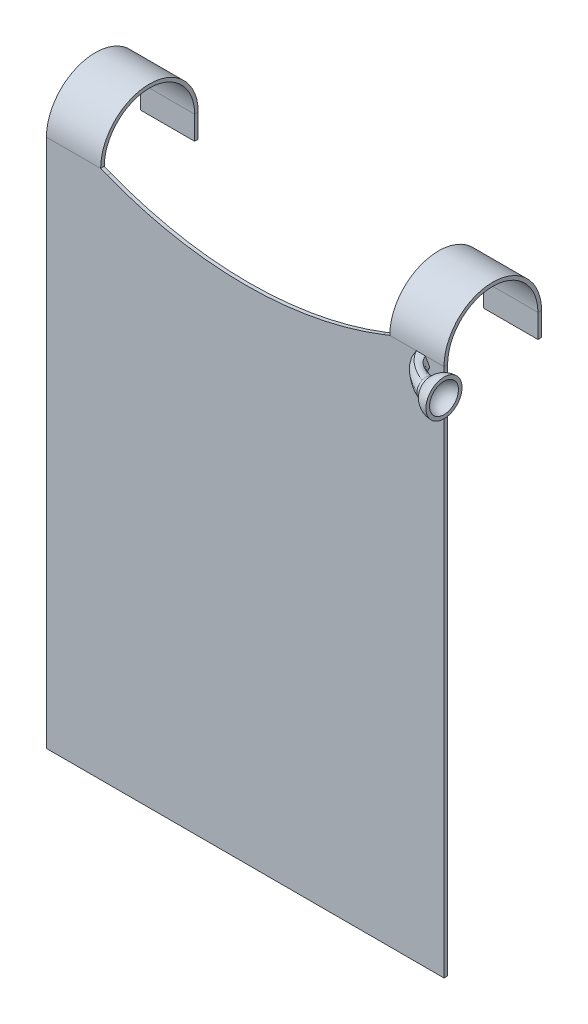
ISO-10303-21;
HEADER;
FILE_DESCRIPTION(('STEP AP214'),'2;1');
FILE_NAME('part.step','',(''),(''),'','','');
FILE_SCHEMA(('AUTOMOTIVE_DESIGN { 1 0 10303 214 1 1 1 1 }'));
ENDSEC;
DATA;
#1=APPLICATION_CONTEXT('core data for automotive mechanical design processes');
#2=APPLICATION_PROTOCOL_DEFINITION('international standard','automotive_design',2000,#1);
#3=PRODUCT_CONTEXT('',#1,'mechanical');
#4=PRODUCT('Part','Part','',(#3));
#5=PRODUCT_RELATED_PRODUCT_CATEGORY('part','',(#4));
#6=PRODUCT_DEFINITION_FORMATION('','',#4);
#7=PRODUCT_DEFINITION_CONTEXT('part definition',#1,'design');
#8=PRODUCT_DEFINITION('design','',#6,#7);
#9=PRODUCT_DEFINITION_SHAPE('','',#8);
#10=(LENGTH_UNIT() NAMED_UNIT(*) SI_UNIT(.MILLI.,.METRE.));
#11=(NAMED_UNIT(*) PLANE_ANGLE_UNIT() SI_UNIT($,.RADIAN.));
#12=(NAMED_UNIT(*) SI_UNIT($,.STERADIAN.) SOLID_ANGLE_UNIT());
#13=UNCERTAINTY_MEASURE_WITH_UNIT(LENGTH_MEASURE(1.E-05),#10,'distance_accuracy_value','');
#14=(GEOMETRIC_REPRESENTATION_CONTEXT(3) GLOBAL_UNCERTAINTY_ASSIGNED_CONTEXT((#13)) GLOBAL_UNIT_ASSIGNED_CONTEXT((#10,
#11,#12)) REPRESENTATION_CONTEXT('',''));
#15=CARTESIAN_POINT('',(0.,0.,0.));
#16=DIRECTION('',(0.,0.,1.));
#17=DIRECTION('',(1.,0.,0.));
#18=AXIS2_PLACEMENT_3D('',#15,#16,#17);
#19=CARTESIAN_POINT('',(284.48,236.22,25.4));
#20=DIRECTION('',(-1.,0.,0.));
#21=DIRECTION('',(0.,-1.,0.));
#22=AXIS2_PLACEMENT_3D('',#19,#20,#21);
#23=CYLINDRICAL_SURFACE('',#22,12.7);
#24=CARTESIAN_POINT('',(279.4,236.22,25.4));
#25=DIRECTION('',(1.,0.,0.));
#26=DIRECTION('',(0.,1.,0.));
#27=AXIS2_PLACEMENT_3D('',#24,#25,#26);
#28=CIRCLE('',#27,12.7);
#29=CARTESIAN_POINT('',(279.4,247.766167143968,30.6895388109299));
#30=VERTEX_POINT('',#29);
#31=CARTESIAN_POINT('',(279.4,237.412255100103,38.0445594282148));
#32=VERTEX_POINT('',#31);
#33=EDGE_CURVE('E313',#30,#32,#28,.T.);
#34=ORIENTED_EDGE('',*,*,#33,.T.);
#35=CARTESIAN_POINT('',(279.4,225.865216039082,32.7550922603241));
#36=VERTEX_POINT('',#35);
#37=EDGE_CURVE('E363',#32,#36,#28,.T.);
#38=ORIENTED_EDGE('',*,*,#37,.T.);
#39=CARTESIAN_POINT('',(279.4,224.673832856091,20.110461189097));
#40=VERTEX_POINT('',#39);
#41=EDGE_CURVE('E469',#36,#40,#28,.T.);
#42=ORIENTED_EDGE('',*,*,#41,.T.);
#43=CARTESIAN_POINT('',(279.4,235.02774489949,12.7554405725084));
#44=VERTEX_POINT('',#43);
#45=EDGE_CURVE('E502',#40,#44,#28,.T.);
#46=ORIENTED_EDGE('',*,*,#45,.T.);
#47=CARTESIAN_POINT('',(279.4,246.574783960918,18.0449077396761));
#48=VERTEX_POINT('',#47);
#49=EDGE_CURVE('E444',#44,#48,#28,.T.);
#50=ORIENTED_EDGE('',*,*,#49,.T.);
#51=EDGE_CURVE('E431',#48,#30,#28,.T.);
#52=ORIENTED_EDGE('',*,*,#51,.T.);
#53=EDGE_LOOP('',(#34,#38,#42,#46,#50,#52));
#54=FACE_BOUND('',#53,.T.);
#55=CARTESIAN_POINT('',(282.802954743875,236.22,25.4));
#56=DIRECTION('',(1.,0.,0.));
#57=DIRECTION('',(0.,0.,-1.));
#58=AXIS2_PLACEMENT_3D('',#55,#56,#57);
#59=CIRCLE('',#58,12.7);
#60=CARTESIAN_POINT('',(282.802954743875,236.22,12.7));
#61=VERTEX_POINT('',#60);
#62=EDGE_CURVE('E13',#61,#61,#59,.T.);
#63=ORIENTED_EDGE('',*,*,#62,.F.);
#64=EDGE_LOOP('',(#63));
#65=FACE_BOUND('',#64,.T.);
#66=ADVANCED_FACE('F118',(#54,#65),#23,.T.);
#67=CARTESIAN_POINT('',(0.,0.,0.));
#68=DIRECTION('',(0.,0.,1.));
#69=DIRECTION('',(1.,0.,0.));
#70=AXIS2_PLACEMENT_3D('',#67,#68,#69);
#71=PLANE('',#70);
#72=DIRECTION('',(0.500000000000002,-0.866025403784438,0.));
#73=VECTOR('',#72,1.);
#74=CARTESIAN_POINT('',(234.068755819377,237.921477371938,0.));
#75=LINE('',#74,#73);
#76=CARTESIAN_POINT('',(234.068755819377,237.921477371938,0.));
#77=VERTEX_POINT('',#76);
#78=CARTESIAN_POINT('',(240.418755819377,226.922954743875,0.));
#79=VERTEX_POINT('',#78);
#80=EDGE_CURVE('E674',#77,#79,#75,.T.);
#81=ORIENTED_EDGE('',*,*,#80,.F.);
#82=DIRECTION('',(-0.499999999999998,-0.86602540378444,0.));
#83=VECTOR('',#82,1.);
#84=CARTESIAN_POINT('',(240.418755819377,248.92,0.));
#85=LINE('',#84,#83);
#86=CARTESIAN_POINT('',(240.418755819377,248.92,0.));
#87=VERTEX_POINT('',#86);
#88=EDGE_CURVE('E666',#87,#77,#85,.T.);
#89=ORIENTED_EDGE('',*,*,#88,.F.);
#90=DIRECTION('',(1.,0.,0.));
#91=VECTOR('',#90,1.);
#92=CARTESIAN_POINT('',(279.4,248.92,0.));
#93=LINE('',#92,#91);
#94=CARTESIAN_POINT('',(203.2,248.92,0.));
#95=VERTEX_POINT('',#94);
#96=EDGE_CURVE('E591',#87,#95,#93,.F.);
#97=ORIENTED_EDGE('',*,*,#96,.T.);
#98=DIRECTION('',(0.931625870627103,0.36341881786486,0.));
#99=VECTOR('',#98,1.);
#100=CARTESIAN_POINT('',(-57.4396553518734,147.246830090149,0.));
#101=LINE('',#100,#99);
#102=CARTESIAN_POINT('',(193.847597449118,245.271712434789,0.));
#103=VERTEX_POINT('',#102);
#104=EDGE_CURVE('E569',#103,#95,#101,.T.);
#105=ORIENTED_EDGE('',*,*,#104,.F.);
#106=CARTESIAN_POINT('',(0.,742.200951827285,0.));
#107=DIRECTION('',(0.,0.,1.));
#108=DIRECTION('',(1.,0.,0.));
#109=AXIS2_PLACEMENT_3D('',#106,#107,#108);
#110=CIRCLE('',#109,533.4);
#111=CARTESIAN_POINT('',(-193.847597449118,245.271712434789,0.));
#112=VERTEX_POINT('',#111);
#113=EDGE_CURVE('E556',#112,#103,#110,.T.);
#114=ORIENTED_EDGE('',*,*,#113,.F.);
#115=DIRECTION('',(0.931625870627103,-0.36341881786486,0.));
#116=VECTOR('',#115,1.);
#117=CARTESIAN_POINT('',(57.4396553518734,147.246830090149,0.));
#118=LINE('',#117,#116);
#119=CARTESIAN_POINT('',(-203.2,248.92,0.));
#120=VERTEX_POINT('',#119);
#121=EDGE_CURVE('E561',#120,#112,#118,.T.);
#122=ORIENTED_EDGE('',*,*,#121,.F.);
#123=CARTESIAN_POINT('',(-279.4,248.92,0.));
#124=VERTEX_POINT('',#123);
#125=EDGE_CURVE('E588',#120,#124,#93,.F.);
#126=ORIENTED_EDGE('',*,*,#125,.T.);
#127=DIRECTION('',(0.,-1.,0.));
#128=VECTOR('',#127,1.);
#129=CARTESIAN_POINT('',(-279.4,317.5,0.));
#130=LINE('',#129,#128);
#131=CARTESIAN_POINT('',(-279.4,-495.3,0.));
#132=VERTEX_POINT('',#131);
#133=EDGE_CURVE('E280',#124,#132,#130,.T.);
#134=ORIENTED_EDGE('',*,*,#133,.T.);
#135=DIRECTION('',(-1.,0.,0.));
#136=VECTOR('',#135,1.);
#137=CARTESIAN_POINT('',(279.4,-495.3,0.));
#138=LINE('',#137,#136);
#139=CARTESIAN_POINT('',(279.4,-495.3,0.));
#140=VERTEX_POINT('',#139);
#141=EDGE_CURVE('E284',#140,#132,#138,.T.);
#142=ORIENTED_EDGE('',*,*,#141,.F.);
#143=DIRECTION('',(0.,1.,0.));
#144=VECTOR('',#143,1.);
#145=CARTESIAN_POINT('',(279.4,317.5,0.));
#146=LINE('',#145,#144);
#147=CARTESIAN_POINT('',(279.4,248.92,0.));
#148=VERTEX_POINT('',#147);
#149=EDGE_CURVE('E271',#140,#148,#146,.T.);
#150=ORIENTED_EDGE('',*,*,#149,.T.);
#151=CARTESIAN_POINT('',(253.118755819377,248.92,0.));
#152=VERTEX_POINT('',#151);
#153=EDGE_CURVE('E599',#148,#152,#93,.F.);
#154=ORIENTED_EDGE('',*,*,#153,.T.);
#155=DIRECTION('',(-0.499999999999998,0.86602540378444,0.));
#156=VECTOR('',#155,1.);
#157=CARTESIAN_POINT('',(259.468755819377,237.921477371938,0.));
#158=LINE('',#157,#156);
#159=CARTESIAN_POINT('',(259.468755819377,237.921477371938,0.));
#160=VERTEX_POINT('',#159);
#161=EDGE_CURVE('E665',#160,#152,#158,.T.);
#162=ORIENTED_EDGE('',*,*,#161,.F.);
#163=DIRECTION('',(0.500000000000002,0.866025403784437,0.));
#164=VECTOR('',#163,1.);
#165=CARTESIAN_POINT('',(253.118755819377,226.922954743875,0.));
#166=LINE('',#165,#164);
#167=CARTESIAN_POINT('',(253.118755819377,226.922954743875,0.));
#168=VERTEX_POINT('',#167);
#169=EDGE_CURVE('E305',#168,#160,#166,.T.);
#170=ORIENTED_EDGE('',*,*,#169,.F.);
#171=DIRECTION('',(1.,0.,0.));
#172=VECTOR('',#171,1.);
#173=CARTESIAN_POINT('',(240.418755819377,226.922954743875,0.));
#174=LINE('',#173,#172);
#175=EDGE_CURVE('E478',#79,#168,#174,.T.);
#176=ORIENTED_EDGE('',*,*,#175,.F.);
#177=EDGE_LOOP('',(#81,#89,#97,#105,#114,#122,#126,#134,#142,#150,#154,#162,#170,#176));
#178=FACE_BOUND('',#177,.T.);
#179=ADVANCED_FACE('F286',(#178),#71,.T.);
#180=CARTESIAN_POINT('',(-1.66533453693773E-13,215.9,-137.16));
#181=DIRECTION('',(0.,1.,0.));
#182=DIRECTION('',(1.,0.,0.));
#183=AXIS2_PLACEMENT_3D('',#180,#181,#182);
#184=PLANE('',#183);
#185=DIRECTION('',(-1.,0.,0.));
#186=VECTOR('',#185,1.);
#187=CARTESIAN_POINT('',(-1.66533453693773E-13,215.9,-132.08));
#188=LINE('',#187,#186);
#189=CARTESIAN_POINT('',(203.2,215.9,-132.08));
#190=VERTEX_POINT('',#189);
#191=CARTESIAN_POINT('',(279.4,215.9,-132.08));
#192=VERTEX_POINT('',#191);
#193=EDGE_CURVE('E627',#190,#192,#188,.F.);
#194=ORIENTED_EDGE('',*,*,#193,.F.);
#195=DIRECTION('',(0.,0.,1.));
#196=VECTOR('',#195,1.);
#197=CARTESIAN_POINT('',(203.2,215.9,-137.160012));
#198=LINE('',#197,#196);
#199=CARTESIAN_POINT('',(203.2,215.9,-137.16));
#200=VERTEX_POINT('',#199);
#201=EDGE_CURVE('E534',#200,#190,#198,.T.);
#202=ORIENTED_EDGE('',*,*,#201,.F.);
#203=DIRECTION('',(1.,0.,0.));
#204=VECTOR('',#203,1.);
#205=CARTESIAN_POINT('',(-1.66533453693773E-13,215.9,-137.16));
#206=LINE('',#205,#204);
#207=CARTESIAN_POINT('',(279.4,215.9,-137.16));
#208=VERTEX_POINT('',#207);
#209=EDGE_CURVE('E641',#200,#208,#206,.T.);
#210=ORIENTED_EDGE('',*,*,#209,.T.);
#211=DIRECTION('',(0.,0.,-1.));
#212=VECTOR('',#211,1.);
#213=CARTESIAN_POINT('',(279.4,215.9,-137.16));
#214=LINE('',#213,#212);
#215=EDGE_CURVE('E607',#192,#208,#214,.T.);
#216=ORIENTED_EDGE('',*,*,#215,.F.);
#217=EDGE_LOOP('',(#194,#202,#210,#216));
#218=FACE_BOUND('',#217,.T.);
#219=ADVANCED_FACE('F746',(#218),#184,.F.);
#220=CARTESIAN_POINT('',(-279.4,215.9,-137.16));
#221=VERTEX_POINT('',#220);
#222=CARTESIAN_POINT('',(-203.2,215.9,-137.16));
#223=VERTEX_POINT('',#222);
#224=EDGE_CURVE('E608',#221,#223,#206,.T.);
#225=ORIENTED_EDGE('',*,*,#224,.T.);
#226=DIRECTION('',(0.,0.,1.));
#227=VECTOR('',#226,1.);
#228=CARTESIAN_POINT('',(-203.2,215.9,-137.160012));
#229=LINE('',#228,#227);
#230=CARTESIAN_POINT('',(-203.2,215.9,-132.08));
#231=VERTEX_POINT('',#230);
#232=EDGE_CURVE('E512',#223,#231,#229,.T.);
#233=ORIENTED_EDGE('',*,*,#232,.T.);
#234=CARTESIAN_POINT('',(-279.4,215.9,-132.08));
#235=VERTEX_POINT('',#234);
#236=EDGE_CURVE('E628',#235,#231,#188,.F.);
#237=ORIENTED_EDGE('',*,*,#236,.F.);
#238=DIRECTION('',(0.,0.,-1.));
#239=VECTOR('',#238,1.);
#240=CARTESIAN_POINT('',(-279.4,215.9,-137.16));
#241=LINE('',#240,#239);
#242=EDGE_CURVE('E605',#235,#221,#241,.T.);
#243=ORIENTED_EDGE('',*,*,#242,.T.);
#244=EDGE_LOOP('',(#225,#233,#237,#243));
#245=FACE_BOUND('',#244,.T.);
#246=ADVANCED_FACE('F748',(#245),#184,.F.);
#247=CARTESIAN_POINT('',(-1.66533453693773E-13,232.41,-137.16));
#248=DIRECTION('',(0.,0.,-1.));
#249=DIRECTION('',(-1.,0.,0.));
#250=AXIS2_PLACEMENT_3D('',#247,#248,#249);
#251=PLANE('',#250);
#252=ORIENTED_EDGE('',*,*,#209,.F.);
#253=DIRECTION('',(0.,1.,0.));
#254=VECTOR('',#253,1.);
#255=CARTESIAN_POINT('',(203.2,232.41,-137.16));
#256=LINE('',#255,#254);
#257=CARTESIAN_POINT('',(203.2,248.92,-137.16));
#258=VERTEX_POINT('',#257);
#259=EDGE_CURVE('E543',#200,#258,#256,.T.);
#260=ORIENTED_EDGE('',*,*,#259,.T.);
#261=DIRECTION('',(-1.,0.,0.));
#262=VECTOR('',#261,1.);
#263=CARTESIAN_POINT('',(-1.66533453693773E-13,248.92,-137.16));
#264=LINE('',#263,#262);
#265=CARTESIAN_POINT('',(279.4,248.92,-137.16));
#266=VERTEX_POINT('',#265);
#267=EDGE_CURVE('E635',#266,#258,#264,.T.);
#268=ORIENTED_EDGE('',*,*,#267,.F.);
#269=DIRECTION('',(0.,1.,0.));
#270=VECTOR('',#269,1.);
#271=CARTESIAN_POINT('',(279.4,232.41,-137.16));
#272=LINE('',#271,#270);
#273=EDGE_CURVE('E638',#208,#266,#272,.T.);
#274=ORIENTED_EDGE('',*,*,#273,.F.);
#275=EDGE_LOOP('',(#252,#260,#268,#274));
#276=FACE_BOUND('',#275,.T.);
#277=ADVANCED_FACE('F741',(#276),#251,.T.);
#278=CARTESIAN_POINT('',(-203.2,248.92,-137.16));
#279=VERTEX_POINT('',#278);
#280=CARTESIAN_POINT('',(-279.4,248.92,-137.16));
#281=VERTEX_POINT('',#280);
#282=EDGE_CURVE('E634',#279,#281,#264,.T.);
#283=ORIENTED_EDGE('',*,*,#282,.F.);
#284=DIRECTION('',(0.,-1.,0.));
#285=VECTOR('',#284,1.);
#286=CARTESIAN_POINT('',(-203.2,232.41,-137.16));
#287=LINE('',#286,#285);
#288=EDGE_CURVE('E538',#279,#223,#287,.T.);
#289=ORIENTED_EDGE('',*,*,#288,.T.);
#290=ORIENTED_EDGE('',*,*,#224,.F.);
#291=DIRECTION('',(0.,-1.,0.));
#292=VECTOR('',#291,1.);
#293=CARTESIAN_POINT('',(-279.4,232.41,-137.16));
#294=LINE('',#293,#292);
#295=EDGE_CURVE('E631',#281,#221,#294,.T.);
#296=ORIENTED_EDGE('',*,*,#295,.F.);
#297=EDGE_LOOP('',(#283,#289,#290,#296));
#298=FACE_BOUND('',#297,.T.);
#299=ADVANCED_FACE('F710',(#298),#251,.T.);
#300=CARTESIAN_POINT('',(-1.66533453693773E-13,232.41,-132.08));
#301=DIRECTION('',(0.,0.,-1.));
#302=DIRECTION('',(-1.,0.,0.));
#303=AXIS2_PLACEMENT_3D('',#300,#301,#302);
#304=PLANE('',#303);
#305=DIRECTION('',(0.,1.,0.));
#306=VECTOR('',#305,1.);
#307=CARTESIAN_POINT('',(203.2,232.41,-132.08));
#308=LINE('',#307,#306);
#309=CARTESIAN_POINT('',(203.2,248.92,-132.08));
#310=VERTEX_POINT('',#309);
#311=EDGE_CURVE('E541',#190,#310,#308,.T.);
#312=ORIENTED_EDGE('',*,*,#311,.F.);
#313=ORIENTED_EDGE('',*,*,#193,.T.);
#314=DIRECTION('',(0.,1.,0.));
#315=VECTOR('',#314,1.);
#316=CARTESIAN_POINT('',(279.4,232.41,-132.08));
#317=LINE('',#316,#315);
#318=CARTESIAN_POINT('',(279.4,248.92,-132.08));
#319=VERTEX_POINT('',#318);
#320=EDGE_CURVE('E624',#192,#319,#317,.T.);
#321=ORIENTED_EDGE('',*,*,#320,.T.);
#322=DIRECTION('',(-1.,0.,0.));
#323=VECTOR('',#322,1.);
#324=CARTESIAN_POINT('',(-1.66533453693773E-13,248.92,-132.08));
#325=LINE('',#324,#323);
#326=EDGE_CURVE('E621',#319,#310,#325,.T.);
#327=ORIENTED_EDGE('',*,*,#326,.T.);
#328=EDGE_LOOP('',(#312,#313,#321,#327));
#329=FACE_BOUND('',#328,.T.);
#330=ADVANCED_FACE('F732',(#329),#304,.F.);
#331=DIRECTION('',(0.,-1.,0.));
#332=VECTOR('',#331,1.);
#333=CARTESIAN_POINT('',(-203.2,232.41,-132.08));
#334=LINE('',#333,#332);
#335=CARTESIAN_POINT('',(-203.2,248.92,-132.08));
#336=VERTEX_POINT('',#335);
#337=EDGE_CURVE('E536',#336,#231,#334,.T.);
#338=ORIENTED_EDGE('',*,*,#337,.F.);
#339=CARTESIAN_POINT('',(-279.4,248.92,-132.08));
#340=VERTEX_POINT('',#339);
#341=EDGE_CURVE('E619',#336,#340,#325,.T.);
#342=ORIENTED_EDGE('',*,*,#341,.T.);
#343=DIRECTION('',(0.,1.,0.));
#344=VECTOR('',#343,1.);
#345=CARTESIAN_POINT('',(-279.4,232.41,-132.08));
#346=LINE('',#345,#344);
#347=EDGE_CURVE('E616',#340,#235,#346,.F.);
#348=ORIENTED_EDGE('',*,*,#347,.T.);
#349=ORIENTED_EDGE('',*,*,#236,.T.);
#350=EDGE_LOOP('',(#338,#342,#348,#349));
#351=FACE_BOUND('',#350,.T.);
#352=ADVANCED_FACE('F764',(#351),#304,.F.);
#353=CARTESIAN_POINT('',(0.,0.,-5.08));
#354=DIRECTION('',(0.,0.,1.));
#355=DIRECTION('',(1.,0.,0.));
#356=AXIS2_PLACEMENT_3D('',#353,#354,#355);
#357=PLANE('',#356);
#358=DIRECTION('',(0.931625870627103,0.36341881786486,0.));
#359=VECTOR('',#358,1.);
#360=CARTESIAN_POINT('',(-57.4396553518734,147.246830090149,-5.08));
#361=LINE('',#360,#359);
#362=CARTESIAN_POINT('',(193.847597449118,245.271712434789,-5.08));
#363=VERTEX_POINT('',#362);
#364=CARTESIAN_POINT('',(203.2,248.92,-5.08));
#365=VERTEX_POINT('',#364);
#366=EDGE_CURVE('E566',#363,#365,#361,.T.);
#367=ORIENTED_EDGE('',*,*,#366,.T.);
#368=DIRECTION('',(1.,0.,0.));
#369=VECTOR('',#368,1.);
#370=CARTESIAN_POINT('',(279.4,248.92,-5.08));
#371=LINE('',#370,#369);
#372=CARTESIAN_POINT('',(279.4,248.92,-5.08));
#373=VERTEX_POINT('',#372);
#374=EDGE_CURVE('E649',#373,#365,#371,.F.);
#375=ORIENTED_EDGE('',*,*,#374,.F.);
#376=DIRECTION('',(0.,1.,0.));
#377=VECTOR('',#376,1.);
#378=CARTESIAN_POINT('',(279.4,317.5,-5.08));
#379=LINE('',#378,#377);
#380=CARTESIAN_POINT('',(279.4,-495.3,-5.08));
#381=VERTEX_POINT('',#380);
#382=EDGE_CURVE('E601',#381,#373,#379,.T.);
#383=ORIENTED_EDGE('',*,*,#382,.F.);
#384=DIRECTION('',(1.,0.,0.));
#385=VECTOR('',#384,1.);
#386=CARTESIAN_POINT('',(-279.4,-495.3,-5.08));
#387=LINE('',#386,#385);
#388=CARTESIAN_POINT('',(-279.4,-495.3,-5.08));
#389=VERTEX_POINT('',#388);
#390=EDGE_CURVE('E296',#389,#381,#387,.T.);
#391=ORIENTED_EDGE('',*,*,#390,.F.);
#392=DIRECTION('',(0.,-1.,0.));
#393=VECTOR('',#392,1.);
#394=CARTESIAN_POINT('',(-279.4,317.5,-5.08));
#395=LINE('',#394,#393);
#396=CARTESIAN_POINT('',(-279.4,248.92,-5.08));
#397=VERTEX_POINT('',#396);
#398=EDGE_CURVE('E126',#397,#389,#395,.T.);
#399=ORIENTED_EDGE('',*,*,#398,.F.);
#400=CARTESIAN_POINT('',(-203.2,248.92,-5.08));
#401=VERTEX_POINT('',#400);
#402=EDGE_CURVE('E648',#401,#397,#371,.F.);
#403=ORIENTED_EDGE('',*,*,#402,.F.);
#404=DIRECTION('',(0.931625870627103,-0.36341881786486,0.));
#405=VECTOR('',#404,1.);
#406=CARTESIAN_POINT('',(57.4396553518734,147.246830090149,-5.08));
#407=LINE('',#406,#405);
#408=CARTESIAN_POINT('',(-193.847597449118,245.271712434789,-5.08));
#409=VERTEX_POINT('',#408);
#410=EDGE_CURVE('E141',#401,#409,#407,.T.);
#411=ORIENTED_EDGE('',*,*,#410,.T.);
#412=CARTESIAN_POINT('',(0.,742.200951827285,-5.08));
#413=DIRECTION('',(0.,0.,1.));
#414=DIRECTION('',(1.,0.,0.));
#415=AXIS2_PLACEMENT_3D('',#412,#413,#414);
#416=CIRCLE('',#415,533.4);
#417=EDGE_CURVE('E549',#409,#363,#416,.T.);
#418=ORIENTED_EDGE('',*,*,#417,.T.);
#419=EDGE_LOOP('',(#367,#375,#383,#391,#399,#403,#411,#418));
#420=FACE_BOUND('',#419,.T.);
#421=ADVANCED_FACE('F725',(#420),#357,.F.);
#422=CARTESIAN_POINT('',(279.4,248.92,-68.58));
#423=DIRECTION('',(1.,0.,0.));
#424=DIRECTION('',(0.,0.,-1.));
#425=AXIS2_PLACEMENT_3D('',#422,#423,#424);
#426=CYLINDRICAL_SURFACE('',#425,68.58);
#427=ORIENTED_EDGE('',*,*,#267,.T.);
#428=CARTESIAN_POINT('',(203.2,248.92,-68.58));
#429=DIRECTION('',(1.,0.,0.));
#430=DIRECTION('',(0.,0.,-1.));
#431=AXIS2_PLACEMENT_3D('',#428,#429,#430);
#432=CIRCLE('',#431,68.58);
#433=EDGE_CURVE('E578',#95,#258,#432,.F.);
#434=ORIENTED_EDGE('',*,*,#433,.F.);
#435=ORIENTED_EDGE('',*,*,#96,.F.);
#436=DIRECTION('',(-1.,0.,0.));
#437=VECTOR('',#436,1.);
#438=CARTESIAN_POINT('',(253.118755819377,248.92,0.));
#439=LINE('',#438,#437);
#440=EDGE_CURVE('E437',#152,#87,#439,.T.);
#441=ORIENTED_EDGE('',*,*,#440,.F.);
#442=ORIENTED_EDGE('',*,*,#153,.F.);
#443=CARTESIAN_POINT('',(279.4,248.92,-68.58));
#444=DIRECTION('',(1.,0.,0.));
#445=DIRECTION('',(0.,0.,-1.));
#446=AXIS2_PLACEMENT_3D('',#443,#444,#445);
#447=CIRCLE('',#446,68.58);
#448=EDGE_CURVE('E592',#266,#148,#447,.T.);
#449=ORIENTED_EDGE('',*,*,#448,.F.);
#450=EDGE_LOOP('',(#427,#434,#435,#441,#442,#449));
#451=FACE_BOUND('',#450,.T.);
#452=ADVANCED_FACE('F661',(#451),#426,.T.);
#453=ORIENTED_EDGE('',*,*,#125,.F.);
#454=CARTESIAN_POINT('',(-203.2,248.92,-68.58));
#455=DIRECTION('',(1.,0.,0.));
#456=DIRECTION('',(0.,0.,-1.));
#457=AXIS2_PLACEMENT_3D('',#454,#455,#456);
#458=CIRCLE('',#457,68.58);
#459=EDGE_CURVE('E572',#279,#120,#458,.T.);
#460=ORIENTED_EDGE('',*,*,#459,.F.);
#461=ORIENTED_EDGE('',*,*,#282,.T.);
#462=CARTESIAN_POINT('',(-279.4,248.92,-68.58));
#463=DIRECTION('',(1.,0.,0.));
#464=DIRECTION('',(0.,0.,-1.));
#465=AXIS2_PLACEMENT_3D('',#462,#463,#464);
#466=CIRCLE('',#465,68.58);
#467=EDGE_CURVE('E593',#124,#281,#466,.F.);
#468=ORIENTED_EDGE('',*,*,#467,.F.);
#469=EDGE_LOOP('',(#453,#460,#461,#468));
#470=FACE_BOUND('',#469,.T.);
#471=ADVANCED_FACE('F706',(#470),#426,.T.);
#472=CARTESIAN_POINT('',(279.4,248.92,-68.58));
#473=DIRECTION('',(1.,0.,0.));
#474=DIRECTION('',(0.,0.,-1.));
#475=AXIS2_PLACEMENT_3D('',#472,#473,#474);
#476=CYLINDRICAL_SURFACE('',#475,63.5);
#477=CARTESIAN_POINT('',(203.2,248.92,-68.58));
#478=DIRECTION('',(-1.,0.,0.));
#479=DIRECTION('',(0.,0.,1.));
#480=AXIS2_PLACEMENT_3D('',#477,#478,#479);
#481=CIRCLE('',#480,63.5);
#482=EDGE_CURVE('E584',#365,#310,#481,.T.);
#483=ORIENTED_EDGE('',*,*,#482,.T.);
#484=ORIENTED_EDGE('',*,*,#326,.F.);
#485=CARTESIAN_POINT('',(279.4,248.92,-68.58));
#486=DIRECTION('',(1.,0.,0.));
#487=DIRECTION('',(0.,0.,-1.));
#488=AXIS2_PLACEMENT_3D('',#485,#486,#487);
#489=CIRCLE('',#488,63.5);
#490=EDGE_CURVE('E587',#319,#373,#489,.T.);
#491=ORIENTED_EDGE('',*,*,#490,.T.);
#492=ORIENTED_EDGE('',*,*,#374,.T.);
#493=EDGE_LOOP('',(#483,#484,#491,#492));
#494=FACE_BOUND('',#493,.T.);
#495=ADVANCED_FACE('F728',(#494),#476,.F.);
#496=CARTESIAN_POINT('',(-203.2,248.92,-68.58));
#497=DIRECTION('',(1.,0.,0.));
#498=DIRECTION('',(0.,0.,-1.));
#499=AXIS2_PLACEMENT_3D('',#496,#497,#498);
#500=CIRCLE('',#499,63.5);
#501=EDGE_CURVE('E575',#336,#401,#500,.T.);
#502=ORIENTED_EDGE('',*,*,#501,.T.);
#503=ORIENTED_EDGE('',*,*,#402,.T.);
#504=CARTESIAN_POINT('',(-279.4,248.92,-68.58));
#505=DIRECTION('',(1.,0.,0.));
#506=DIRECTION('',(0.,0.,-1.));
#507=AXIS2_PLACEMENT_3D('',#504,#505,#506);
#508=CIRCLE('',#507,63.5);
#509=EDGE_CURVE('E652',#397,#340,#508,.F.);
#510=ORIENTED_EDGE('',*,*,#509,.T.);
#511=ORIENTED_EDGE('',*,*,#341,.F.);
#512=EDGE_LOOP('',(#502,#503,#510,#511));
#513=FACE_BOUND('',#512,.T.);
#514=ADVANCED_FACE('F769',(#513),#476,.F.);
#515=CARTESIAN_POINT('',(279.4,317.5,-5.08));
#516=DIRECTION('',(1.,0.,0.));
#517=DIRECTION('',(0.,1.,0.));
#518=AXIS2_PLACEMENT_3D('',#515,#516,#517);
#519=PLANE('',#518);
#520=ORIENTED_EDGE('',*,*,#382,.T.);
#521=DIRECTION('',(0.,0.,1.));
#522=VECTOR('',#521,1.);
#523=CARTESIAN_POINT('',(279.4,248.92,-5.08));
#524=LINE('',#523,#522);
#525=EDGE_CURVE('E277',#373,#148,#524,.T.);
#526=ORIENTED_EDGE('',*,*,#525,.T.);
#527=ORIENTED_EDGE('',*,*,#149,.F.);
#528=DIRECTION('',(0.,0.,1.));
#529=VECTOR('',#528,1.);
#530=CARTESIAN_POINT('',(279.4,-495.3,-5.08));
#531=LINE('',#530,#529);
#532=EDGE_CURVE('E275',#381,#140,#531,.T.);
#533=ORIENTED_EDGE('',*,*,#532,.F.);
#534=EDGE_LOOP('',(#520,#526,#527,#533));
#535=FACE_BOUND('',#534,.T.);
#536=ADVANCED_FACE('F120',(#535),#519,.T.);
#537=CARTESIAN_POINT('',(-279.4,317.5,-5.08));
#538=DIRECTION('',(-1.,0.,0.));
#539=DIRECTION('',(0.,-1.,0.));
#540=AXIS2_PLACEMENT_3D('',#537,#538,#539);
#541=PLANE('',#540);
#542=DIRECTION('',(0.,0.,1.));
#543=VECTOR('',#542,1.);
#544=CARTESIAN_POINT('',(-279.4,248.92,-5.08));
#545=LINE('',#544,#543);
#546=EDGE_CURVE('E620',#397,#124,#545,.T.);
#547=ORIENTED_EDGE('',*,*,#546,.F.);
#548=ORIENTED_EDGE('',*,*,#398,.T.);
#549=DIRECTION('',(0.,0.,-1.));
#550=VECTOR('',#549,1.);
#551=CARTESIAN_POINT('',(-279.4,-495.3,0.));
#552=LINE('',#551,#550);
#553=EDGE_CURVE('E291',#132,#389,#552,.T.);
#554=ORIENTED_EDGE('',*,*,#553,.F.);
#555=ORIENTED_EDGE('',*,*,#133,.F.);
#556=EDGE_LOOP('',(#547,#548,#554,#555));
#557=FACE_BOUND('',#556,.T.);
#558=ADVANCED_FACE('F722',(#557),#541,.T.);
#559=CARTESIAN_POINT('',(279.4,232.41,-137.16));
#560=DIRECTION('',(-1.,0.,0.));
#561=DIRECTION('',(0.,1.,0.));
#562=AXIS2_PLACEMENT_3D('',#559,#560,#561);
#563=PLANE('',#562);
#564=DIRECTION('',(0.,0.,-1.));
#565=VECTOR('',#564,1.);
#566=CARTESIAN_POINT('',(279.4,248.92,-137.16));
#567=LINE('',#566,#565);
#568=EDGE_CURVE('E611',#319,#266,#567,.T.);
#569=ORIENTED_EDGE('',*,*,#568,.F.);
#570=ORIENTED_EDGE('',*,*,#320,.F.);
#571=ORIENTED_EDGE('',*,*,#215,.T.);
#572=ORIENTED_EDGE('',*,*,#273,.T.);
#573=EDGE_LOOP('',(#569,#570,#571,#572));
#574=FACE_BOUND('',#573,.T.);
#575=ADVANCED_FACE('F737',(#574),#563,.F.);
#576=CARTESIAN_POINT('',(-279.4,232.41,-137.16));
#577=DIRECTION('',(1.,0.,0.));
#578=DIRECTION('',(0.,-1.,0.));
#579=AXIS2_PLACEMENT_3D('',#576,#577,#578);
#580=PLANE('',#579);
#581=ORIENTED_EDGE('',*,*,#347,.F.);
#582=DIRECTION('',(0.,0.,-1.));
#583=VECTOR('',#582,1.);
#584=CARTESIAN_POINT('',(-279.4,248.92,-137.16));
#585=LINE('',#584,#583);
#586=EDGE_CURVE('E281',#340,#281,#585,.T.);
#587=ORIENTED_EDGE('',*,*,#586,.T.);
#588=ORIENTED_EDGE('',*,*,#295,.T.);
#589=ORIENTED_EDGE('',*,*,#242,.F.);
#590=EDGE_LOOP('',(#581,#587,#588,#589));
#591=FACE_BOUND('',#590,.T.);
#592=ADVANCED_FACE('F716',(#591),#580,.F.);
#593=CARTESIAN_POINT('',(-279.4,248.92,-68.58));
#594=DIRECTION('',(-1.,0.,0.));
#595=DIRECTION('',(0.,0.,1.));
#596=AXIS2_PLACEMENT_3D('',#593,#594,#595);
#597=PLANE('',#596);
#598=ORIENTED_EDGE('',*,*,#586,.F.);
#599=ORIENTED_EDGE('',*,*,#509,.F.);
#600=ORIENTED_EDGE('',*,*,#546,.T.);
#601=ORIENTED_EDGE('',*,*,#467,.T.);
#602=EDGE_LOOP('',(#598,#599,#600,#601));
#603=FACE_BOUND('',#602,.T.);
#604=ADVANCED_FACE('F719',(#603),#597,.T.);
#605=CARTESIAN_POINT('',(279.4,248.92,-68.58));
#606=DIRECTION('',(-1.,0.,0.));
#607=DIRECTION('',(0.,0.,1.));
#608=AXIS2_PLACEMENT_3D('',#605,#606,#607);
#609=PLANE('',#608);
#610=ORIENTED_EDGE('',*,*,#490,.F.);
#611=ORIENTED_EDGE('',*,*,#568,.T.);
#612=ORIENTED_EDGE('',*,*,#448,.T.);
#613=ORIENTED_EDGE('',*,*,#525,.F.);
#614=EDGE_LOOP('',(#610,#611,#612,#613));
#615=FACE_BOUND('',#614,.T.);
#616=ADVANCED_FACE('F658',(#615),#609,.F.);
#617=CARTESIAN_POINT('',(203.2,248.92,-68.58));
#618=DIRECTION('',(1.,0.,0.));
#619=DIRECTION('',(0.,0.,-1.));
#620=AXIS2_PLACEMENT_3D('',#617,#618,#619);
#621=PLANE('',#620);
#622=DIRECTION('',(0.,0.,-1.));
#623=VECTOR('',#622,1.);
#624=CARTESIAN_POINT('',(203.2,248.92,0.));
#625=LINE('',#624,#623);
#626=EDGE_CURVE('E564',#95,#365,#625,.T.);
#627=ORIENTED_EDGE('',*,*,#626,.F.);
#628=ORIENTED_EDGE('',*,*,#433,.T.);
#629=DIRECTION('',(0.,0.,1.));
#630=VECTOR('',#629,1.);
#631=CARTESIAN_POINT('',(203.2,248.92,-137.16));
#632=LINE('',#631,#630);
#633=EDGE_CURVE('E581',#258,#310,#632,.T.);
#634=ORIENTED_EDGE('',*,*,#633,.T.);
#635=ORIENTED_EDGE('',*,*,#482,.F.);
#636=EDGE_LOOP('',(#627,#628,#634,#635));
#637=FACE_BOUND('',#636,.T.);
#638=ADVANCED_FACE('F685',(#637),#621,.F.);
#639=CARTESIAN_POINT('',(-203.2,248.92,-68.58));
#640=DIRECTION('',(-1.,0.,0.));
#641=DIRECTION('',(0.,0.,1.));
#642=AXIS2_PLACEMENT_3D('',#639,#640,#641);
#643=PLANE('',#642);
#644=DIRECTION('',(0.,0.,1.));
#645=VECTOR('',#644,1.);
#646=CARTESIAN_POINT('',(-203.2,248.92,-137.16));
#647=LINE('',#646,#645);
#648=EDGE_CURVE('E546',#279,#336,#647,.T.);
#649=ORIENTED_EDGE('',*,*,#648,.F.);
#650=ORIENTED_EDGE('',*,*,#459,.T.);
#651=DIRECTION('',(0.,0.,-1.));
#652=VECTOR('',#651,1.);
#653=CARTESIAN_POINT('',(-203.2,248.92,0.));
#654=LINE('',#653,#652);
#655=EDGE_CURVE('E559',#120,#401,#654,.T.);
#656=ORIENTED_EDGE('',*,*,#655,.T.);
#657=ORIENTED_EDGE('',*,*,#501,.F.);
#658=EDGE_LOOP('',(#649,#650,#656,#657));
#659=FACE_BOUND('',#658,.T.);
#660=ADVANCED_FACE('F703',(#659),#643,.F.);
#661=CARTESIAN_POINT('',(-57.4396553518734,147.246830090149,-5.08));
#662=DIRECTION('',(0.36341881786486,-0.931625870627103,0.));
#663=DIRECTION('',(0.931625870627103,0.36341881786486,0.));
#664=AXIS2_PLACEMENT_3D('',#661,#662,#663);
#665=PLANE('',#664);
#666=ORIENTED_EDGE('',*,*,#626,.T.);
#667=ORIENTED_EDGE('',*,*,#366,.F.);
#668=DIRECTION('',(0.,0.,-1.));
#669=VECTOR('',#668,1.);
#670=CARTESIAN_POINT('',(193.847597449118,245.271712434789,-5.08));
#671=LINE('',#670,#669);
#672=EDGE_CURVE('E548',#363,#103,#671,.F.);
#673=ORIENTED_EDGE('',*,*,#672,.T.);
#674=ORIENTED_EDGE('',*,*,#104,.T.);
#675=EDGE_LOOP('',(#666,#667,#673,#674));
#676=FACE_BOUND('',#675,.T.);
#677=ADVANCED_FACE('F690',(#676),#665,.F.);
#678=CARTESIAN_POINT('',(57.4396553518734,147.246830090149,-5.08));
#679=DIRECTION('',(-0.36341881786486,-0.931625870627103,0.));
#680=DIRECTION('',(0.931625870627103,-0.36341881786486,0.));
#681=AXIS2_PLACEMENT_3D('',#678,#679,#680);
#682=PLANE('',#681);
#683=DIRECTION('',(0.,0.,-1.));
#684=VECTOR('',#683,1.);
#685=CARTESIAN_POINT('',(-193.847597449118,245.271712434789,-5.08));
#686=LINE('',#685,#684);
#687=EDGE_CURVE('E551',#409,#112,#686,.F.);
#688=ORIENTED_EDGE('',*,*,#687,.F.);
#689=ORIENTED_EDGE('',*,*,#410,.F.);
#690=ORIENTED_EDGE('',*,*,#655,.F.);
#691=ORIENTED_EDGE('',*,*,#121,.T.);
#692=EDGE_LOOP('',(#688,#689,#690,#691));
#693=FACE_BOUND('',#692,.T.);
#694=ADVANCED_FACE('F698',(#693),#682,.F.);
#695=CARTESIAN_POINT('',(0.,742.200951827285,-5.08));
#696=DIRECTION('',(0.,0.,1.));
#697=DIRECTION('',(1.,0.,0.));
#698=AXIS2_PLACEMENT_3D('',#695,#696,#697);
#699=CYLINDRICAL_SURFACE('',#698,533.4);
#700=ORIENTED_EDGE('',*,*,#113,.T.);
#701=ORIENTED_EDGE('',*,*,#672,.F.);
#702=ORIENTED_EDGE('',*,*,#417,.F.);
#703=ORIENTED_EDGE('',*,*,#687,.T.);
#704=EDGE_LOOP('',(#700,#701,#702,#703));
#705=FACE_BOUND('',#704,.T.);
#706=ADVANCED_FACE('F696',(#705),#699,.F.);
#707=CARTESIAN_POINT('',(-203.2,248.92,-137.160012));
#708=DIRECTION('',(1.,0.,0.));
#709=DIRECTION('',(0.,0.,-1.));
#710=AXIS2_PLACEMENT_3D('',#707,#708,#709);
#711=PLANE('',#710);
#712=ORIENTED_EDGE('',*,*,#648,.T.);
#713=ORIENTED_EDGE('',*,*,#337,.T.);
#714=ORIENTED_EDGE('',*,*,#232,.F.);
#715=ORIENTED_EDGE('',*,*,#288,.F.);
#716=EDGE_LOOP('',(#712,#713,#714,#715));
#717=FACE_BOUND('',#716,.T.);
#718=ADVANCED_FACE('F801',(#717),#711,.T.);
#719=CARTESIAN_POINT('',(203.2,248.92,-137.160012));
#720=DIRECTION('',(-1.,0.,0.));
#721=DIRECTION('',(0.,0.,1.));
#722=AXIS2_PLACEMENT_3D('',#719,#720,#721);
#723=PLANE('',#722);
#724=ORIENTED_EDGE('',*,*,#201,.T.);
#725=ORIENTED_EDGE('',*,*,#311,.T.);
#726=ORIENTED_EDGE('',*,*,#633,.F.);
#727=ORIENTED_EDGE('',*,*,#259,.F.);
#728=EDGE_LOOP('',(#724,#725,#726,#727));
#729=FACE_BOUND('',#728,.T.);
#730=ADVANCED_FACE('F744',(#729),#723,.T.);
#731=CARTESIAN_POINT('',(253.118755819377,226.922954743875,0.));
#732=CARTESIAN_POINT('',(257.573618346721,227.02045099004,11.2193539804434));
#733=CARTESIAN_POINT('',(266.334033073595,226.270781867232,17.9228584376726));
#734=CARTESIAN_POINT('',(279.4,224.673947375449,20.1105133716877));
#735=CARTESIAN_POINT('',(253.647922486044,227.839498296214,0.));
#736=CARTESIAN_POINT('',(257.926396124499,227.785344952756,10.8834929265153));
#737=CARTESIAN_POINT('',(266.510421962484,226.884026240325,17.2511363298164));
#738=CARTESIAN_POINT('',(279.4,225.135542158919,19.1029302099034));
#739=CARTESIAN_POINT('',(254.706255819377,229.672585400891,0.));
#740=CARTESIAN_POINT('',(258.631951680054,229.403508030458,10.2522816726618));
#741=CARTESIAN_POINT('',(266.863199740262,228.287265291052,15.9887138221094));
#742=CARTESIAN_POINT('',(279.4,226.323857182672,17.2092964483429));
#743=CARTESIAN_POINT('',(256.293755819377,232.422216057906,0.));
#744=CARTESIAN_POINT('',(259.690285013388,232.055661537522,9.49157103841271));
#745=CARTESIAN_POINT('',(267.392366406929,230.841941648163,14.4672925536113));
#746=CARTESIAN_POINT('',(279.4,228.781056389831,14.9271645455957));
#747=CARTESIAN_POINT('',(257.881255819377,235.171846714922,0.));
#748=CARTESIAN_POINT('',(260.748618346721,234.87675591196,8.96870195778396));
#749=CARTESIAN_POINT('',(267.921533073595,233.734499740024,13.4215543923538));
#750=CARTESIAN_POINT('',(279.399999999999,231.745078199114,13.3585573037095));
#751=CARTESIAN_POINT('',(258.939589152711,237.004933819599,0.));
#752=CARTESIAN_POINT('',(261.454173902276,236.825259073558,8.80255638044837));
#753=CARTESIAN_POINT('',(268.274310851373,235.798418958544,13.0892632376826));
#754=CARTESIAN_POINT('',(279.4,233.924413474555,12.8601205717027));
#755=CARTESIAN_POINT('',(259.468755819377,237.921477371938,0.));
#756=CARTESIAN_POINT('',(261.806951680054,237.804084777206,8.76787678973098));
#757=CARTESIAN_POINT('',(268.450699740262,236.8395268135,13.0199040562478));
#758=CARTESIAN_POINT('',(279.4,235.027803480821,12.7560817995505));
#759=B_SPLINE_SURFACE_WITH_KNOTS('',3,3,((#731,#732,#733,#734),(#735,#736,#737,#738),(#739,#740,
#741,#742),(#743,#744,#745,#746),(#747,#748,#749,#750),(#751,#752,#753,#754),(#755,#756,#757,
#758)),.UNSPECIFIED.,.F.,.F.,.F.,(4,1,1,1,4),(4,4),(0.833333333333333,0.875,0.916666666666667,
0.958333333333333,1.),(0.,1.),.UNSPECIFIED.);
#760=CARTESIAN_POINT('',(259.468755819377,237.921477371938,0.));
#761=CARTESIAN_POINT('',(261.806951680054,237.804084777206,8.76787678973098));
#762=CARTESIAN_POINT('',(268.450699740262,236.8395268135,13.0199040562478));
#763=CARTESIAN_POINT('',(279.4,235.027803480821,12.7560817995505));
#764=B_SPLINE_CURVE_WITH_KNOTS('',3,(#760,#761,#762,#763),.UNSPECIFIED.,.F.,.F.,(4,4),(0.,1.),.UNSPECIFIED.);
#765=EDGE_CURVE('E133',#160,#44,#764,.T.);
#766=CARTESIAN_POINT('',(253.118755819377,226.922954743875,0.));
#767=CARTESIAN_POINT('',(257.573618346721,227.02045099004,11.2193539804434));
#768=CARTESIAN_POINT('',(266.334033073595,226.270781867232,17.9228584376726));
#769=CARTESIAN_POINT('',(279.4,224.673947375449,20.1105133716877));
#770=B_SPLINE_CURVE_WITH_KNOTS('',3,(#766,#767,#768,#769),.UNSPECIFIED.,.F.,.F.,(4,4),(0.,1.),.UNSPECIFIED.);
#771=EDGE_CURVE('E451',#168,#40,#770,.T.);
#772=ORIENTED_EDGE('',*,*,#169,.T.);
#773=ORIENTED_EDGE('',*,*,#765,.T.);
#774=ORIENTED_EDGE('',*,*,#45,.F.);
#775=ORIENTED_EDGE('',*,*,#771,.F.);
#776=EDGE_LOOP('',(#772,#773,#774,#775));
#777=FACE_BOUND('',#776,.T.);
#778=ADVANCED_FACE('F396',(#777),#759,.T.);
#779=CARTESIAN_POINT('',(240.418755819377,226.922954743875,0.));
#780=CARTESIAN_POINT('',(249.106951680054,227.417849829767,15.4339933805932));
#781=CARTESIAN_POINT('',(262.100699740262,227.065579546684,26.3521372379722));
#782=CARTESIAN_POINT('',(279.4,225.866143894628,32.7544315721371));
#783=CARTESIAN_POINT('',(241.477089152711,226.922954743875,0.));
#784=CARTESIAN_POINT('',(249.81250723561,227.203918088835,15.1328119173825));
#785=CARTESIAN_POINT('',(262.45347751804,226.637716064821,25.7497743115508));
#786=CARTESIAN_POINT('',(279.4,225.224348671833,31.8508871825051));
#787=CARTESIAN_POINT('',(243.593755819377,226.922954743875,0.));
#788=CARTESIAN_POINT('',(251.223618346721,226.855325611802,14.4741692910332));
#789=CARTESIAN_POINT('',(263.159033073595,225.940531110755,24.4324890588522));
#790=CARTESIAN_POINT('',(279.4,224.178571240733,29.8749593034571));
#791=CARTESIAN_POINT('',(246.768755819377,226.922954743875,0.));
#792=CARTESIAN_POINT('',(253.340285013387,226.606064078806,13.3844816620555));
#793=CARTESIAN_POINT('',(264.217366406928,225.442008044763,22.2531138008969));
#794=CARTESIAN_POINT('',(279.399999999999,223.430786641747,26.6058964165242));
#795=CARTESIAN_POINT('',(249.943755819378,226.922954743875,0.));
#796=CARTESIAN_POINT('',(255.456951680054,226.647249807009,12.2674077270045));
#797=CARTESIAN_POINT('',(265.275699740262,225.524379501169,20.0189659307948));
#798=CARTESIAN_POINT('',(279.4,223.554343826355,23.2546746113709));
#799=CARTESIAN_POINT('',(252.060422486044,226.922954743875,0.));
#800=CARTESIAN_POINT('',(256.868062791165,226.866586062217,11.5552150343715));
#801=CARTESIAN_POINT('',(265.981255295817,225.963052011584,18.5945805455288));
#802=CARTESIAN_POINT('',(279.4,224.212352591978,21.1180965334719));
#803=CARTESIAN_POINT('',(253.118755819377,226.922954743875,0.));
#804=CARTESIAN_POINT('',(257.573618346721,227.02045099004,11.2193539804434));
#805=CARTESIAN_POINT('',(266.334033073595,226.270781867232,17.9228584376726));
#806=CARTESIAN_POINT('',(279.4,224.673947375449,20.1105133716877));
#807=B_SPLINE_SURFACE_WITH_KNOTS('',3,3,((#779,#780,#781,#782),(#783,#784,#785,#786),(#787,#788,
#789,#790),(#791,#792,#793,#794),(#795,#796,#797,#798),(#799,#800,#801,#802),(#803,#804,#805,
#806)),.UNSPECIFIED.,.F.,.F.,.F.,(4,1,1,1,4),(4,4),(0.666666666666667,0.708333333333334,0.75,
0.791666666666667,0.833333333333333),(0.,1.),.UNSPECIFIED.);
#808=CARTESIAN_POINT('',(240.418755819377,226.922954743875,0.));
#809=CARTESIAN_POINT('',(249.106951680054,227.417849829767,15.4339933805932));
#810=CARTESIAN_POINT('',(262.100699740262,227.065579546684,26.3521372379722));
#811=CARTESIAN_POINT('',(279.4,225.866143894628,32.7544315721371));
#812=B_SPLINE_CURVE_WITH_KNOTS('',3,(#808,#809,#810,#811),.UNSPECIFIED.,.F.,.F.,(4,4),(0.,1.),.UNSPECIFIED.);
#813=EDGE_CURVE('E449',#79,#36,#812,.T.);
#814=ORIENTED_EDGE('',*,*,#175,.T.);
#815=ORIENTED_EDGE('',*,*,#771,.T.);
#816=ORIENTED_EDGE('',*,*,#41,.F.);
#817=ORIENTED_EDGE('',*,*,#813,.F.);
#818=EDGE_LOOP('',(#814,#815,#816,#817));
#819=FACE_BOUND('',#818,.T.);
#820=ADVANCED_FACE('F382',(#819),#807,.T.);
#821=CARTESIAN_POINT('',(234.068755819377,237.921477371938,0.));
#822=CARTESIAN_POINT('',(244.873618346721,238.598882456659,17.1971555900306));
#823=CARTESIAN_POINT('',(259.984033073595,238.429122172406,29.8784616568471));
#824=CARTESIAN_POINT('',(279.4,237.412196519179,38.0439182004495));
#825=CARTESIAN_POINT('',(234.597922486044,237.004933819599,0.));
#826=CARTESIAN_POINT('',(245.226396124499,237.620056753011,17.231835180748));
#827=CARTESIAN_POINT('',(260.160421962484,237.388014317449,29.9478208382819));
#828=CARTESIAN_POINT('',(279.4,236.308806512913,38.1479569726016));
#829=CARTESIAN_POINT('',(235.656255819378,235.171846714922,0.));
#830=CARTESIAN_POINT('',(245.931951680054,235.653301198276,17.2044038082521));
#831=CARTESIAN_POINT('',(260.513199740262,235.287590312656,29.8929580932901));
#832=CARTESIAN_POINT('',(279.4,234.074714058062,38.0656628551139));
#833=CARTESIAN_POINT('',(237.243755819377,232.422216057906,0.));
#834=CARTESIAN_POINT('',(246.990285013387,232.751886158217,16.8754268135237));
#835=CARTESIAN_POINT('',(261.042366406928,232.234390889553,29.2350041038332));
#836=CARTESIAN_POINT('',(279.4,230.869730251916,37.0787318709286));
#837=CARTESIAN_POINT('',(238.831255819378,229.672585400891,0.));
#838=CARTESIAN_POINT('',(248.048618346721,229.971977511981,16.2812219591012));
#839=CARTESIAN_POINT('',(261.571533073595,229.424204254098,28.0465943949883));
#840=CARTESIAN_POINT('',(279.399999999999,228.029265627241,35.2961173076613));
#841=CARTESIAN_POINT('',(239.889589152711,227.839498296214,0.));
#842=CARTESIAN_POINT('',(248.754173902276,228.242810605591,15.7351748438039));
#843=CARTESIAN_POINT('',(261.924310851373,227.798957545994,26.9545001643936));
#844=CARTESIAN_POINT('',(279.4,226.507939117423,33.6579759617692));
#845=CARTESIAN_POINT('',(240.418755819377,226.922954743875,0.));
#846=CARTESIAN_POINT('',(249.106951680054,227.417849829767,15.4339933805932));
#847=CARTESIAN_POINT('',(262.100699740262,227.065579546684,26.3521372379722));
#848=CARTESIAN_POINT('',(279.4,225.866143894628,32.7544315721371));
#849=B_SPLINE_SURFACE_WITH_KNOTS('',3,3,((#821,#822,#823,#824),(#825,#826,#827,#828),(#829,#830,
#831,#832),(#833,#834,#835,#836),(#837,#838,#839,#840),(#841,#842,#843,#844),(#845,#846,#847,
#848)),.UNSPECIFIED.,.F.,.F.,.F.,(4,1,1,1,4),(4,4),(0.500000000000001,0.541666666666667,
0.583333333333334,0.625000000000001,0.666666666666667),(0.,1.),.UNSPECIFIED.);
#850=CARTESIAN_POINT('',(234.068755819377,237.921477371938,0.));
#851=CARTESIAN_POINT('',(244.873618346721,238.598882456659,17.1971555900306));
#852=CARTESIAN_POINT('',(259.984033073595,238.429122172406,29.8784616568471));
#853=CARTESIAN_POINT('',(279.4,237.412196519179,38.0439182004495));
#854=B_SPLINE_CURVE_WITH_KNOTS('',3,(#850,#851,#852,#853),.UNSPECIFIED.,.F.,.F.,(4,4),(0.,1.),.UNSPECIFIED.);
#855=EDGE_CURVE('E430',#77,#32,#854,.T.);
#856=ORIENTED_EDGE('',*,*,#80,.T.);
#857=ORIENTED_EDGE('',*,*,#813,.T.);
#858=ORIENTED_EDGE('',*,*,#37,.F.);
#859=ORIENTED_EDGE('',*,*,#855,.F.);
#860=EDGE_LOOP('',(#856,#857,#858,#859));
#861=FACE_BOUND('',#860,.T.);
#862=ADVANCED_FACE('F370',(#861),#849,.T.);
#863=CARTESIAN_POINT('',(240.418755819377,248.92,0.));
#864=CARTESIAN_POINT('',(249.106951680054,249.382516243824,14.7456783993182));
#865=CARTESIAN_POINT('',(262.100699740262,248.997867118675,24.9755072754224));
#866=CARTESIAN_POINT('',(279.4,247.766052624551,30.6894866283123));
#867=CARTESIAN_POINT('',(239.889589152711,248.003456447661,0.));
#868=CARTESIAN_POINT('',(248.754173902276,248.617622281108,15.0815394532463));
#869=CARTESIAN_POINT('',(261.924310851373,248.384622745581,25.6472293832785));
#870=CARTESIAN_POINT('',(279.4,247.30445784108,31.6970697900966));
#871=CARTESIAN_POINT('',(238.831255819378,246.170369342984,0.));
#872=CARTESIAN_POINT('',(248.048618346721,246.999459203406,15.7127507070998));
#873=CARTESIAN_POINT('',(261.571533073595,246.981383694855,26.9096518909855));
#874=CARTESIAN_POINT('',(279.4,246.116142817329,33.5907035516571));
#875=CARTESIAN_POINT('',(237.243755819377,243.420738685969,0.));
#876=CARTESIAN_POINT('',(246.990285013387,244.347305696343,16.4734613413489));
#877=CARTESIAN_POINT('',(261.042366406928,244.426707337743,28.4310731594837));
#878=CARTESIAN_POINT('',(279.4,243.658943610169,35.8728354544043));
#879=CARTESIAN_POINT('',(235.656255819377,240.671108028953,0.));
#880=CARTESIAN_POINT('',(245.931951680054,241.526211321905,16.9963304219777));
#881=CARTESIAN_POINT('',(260.513199740262,241.534149245882,29.4768113207412));
#882=CARTESIAN_POINT('',(279.4,240.694921800886,37.4414426962906));
#883=CARTESIAN_POINT('',(234.597922486044,238.838020924276,0.));
#884=CARTESIAN_POINT('',(245.226396124499,239.577708160306,17.1624759993132));
#885=CARTESIAN_POINT('',(260.160421962484,239.470230027363,29.8091024754123));
#886=CARTESIAN_POINT('',(279.4,238.515586525445,37.9398794282973));
#887=CARTESIAN_POINT('',(234.068755819377,237.921477371938,0.));
#888=CARTESIAN_POINT('',(244.873618346721,238.598882456659,17.1971555900306));
#889=CARTESIAN_POINT('',(259.984033073595,238.429122172406,29.8784616568471));
#890=CARTESIAN_POINT('',(279.4,237.412196519179,38.0439182004495));
#891=B_SPLINE_SURFACE_WITH_KNOTS('',3,3,((#863,#864,#865,#866),(#867,#868,#869,#870),(#871,#872,
#873,#874),(#875,#876,#877,#878),(#879,#880,#881,#882),(#883,#884,#885,#886),(#887,#888,#889,
#890)),.UNSPECIFIED.,.F.,.F.,.F.,(4,1,1,1,4),(4,4),(0.333333333333334,0.375000000000001,
0.416666666666667,0.458333333333334,0.500000000000001),(0.,1.),.UNSPECIFIED.);
#892=CARTESIAN_POINT('',(240.418755819377,248.92,0.));
#893=CARTESIAN_POINT('',(249.106951680054,249.382516243824,14.7456783993182));
#894=CARTESIAN_POINT('',(262.100699740262,248.997867118675,24.9755072754224));
#895=CARTESIAN_POINT('',(279.4,247.766052624551,30.6894866283123));
#896=B_SPLINE_CURVE_WITH_KNOTS('',3,(#892,#893,#894,#895),.UNSPECIFIED.,.F.,.F.,(4,4),(0.,1.),.UNSPECIFIED.);
#897=EDGE_CURVE('E428',#87,#30,#896,.T.);
#898=ORIENTED_EDGE('',*,*,#88,.T.);
#899=ORIENTED_EDGE('',*,*,#855,.T.);
#900=ORIENTED_EDGE('',*,*,#33,.F.);
#901=ORIENTED_EDGE('',*,*,#897,.F.);
#902=EDGE_LOOP('',(#898,#899,#900,#901));
#903=FACE_BOUND('',#902,.T.);
#904=ADVANCED_FACE('F381',(#903),#891,.T.);
#905=CARTESIAN_POINT('',(253.118755819377,248.92,0.));
#906=CARTESIAN_POINT('',(257.573618346721,248.985117404098,10.5310389991684));
#907=CARTESIAN_POINT('',(266.334033073595,248.203069439222,16.5462284751227));
#908=CARTESIAN_POINT('',(279.4,246.573856105372,18.0455684278628));
#909=CARTESIAN_POINT('',(252.060422486044,248.92,0.));
#910=CARTESIAN_POINT('',(256.868062791165,249.19904914503,10.8322204623791));
#911=CARTESIAN_POINT('',(265.981255295817,248.630932921085,17.1485914015441));
#912=CARTESIAN_POINT('',(279.4,247.215651328167,18.9491128174949));
#913=CARTESIAN_POINT('',(249.943755819377,248.92,0.));
#914=CARTESIAN_POINT('',(255.456951680054,249.547641622063,11.4908630887284));
#915=CARTESIAN_POINT('',(265.275699740262,249.328117875152,18.4658766542427));
#916=CARTESIAN_POINT('',(279.4,248.261428759267,20.9250406965428));
#917=CARTESIAN_POINT('',(246.768755819377,248.92,0.));
#918=CARTESIAN_POINT('',(253.340285013388,249.796903155058,12.5805507177061));
#919=CARTESIAN_POINT('',(264.217366406928,249.826640941142,20.645251912198));
#920=CARTESIAN_POINT('',(279.4,249.009213358253,24.1941035834758));
#921=CARTESIAN_POINT('',(243.593755819377,248.92,0.));
#922=CARTESIAN_POINT('',(251.223618346721,249.755717426856,13.6976246527571));
#923=CARTESIAN_POINT('',(263.159033073595,249.744269484737,22.8793997823002));
#924=CARTESIAN_POINT('',(279.399999999999,248.885656173645,27.545325388629));
#925=CARTESIAN_POINT('',(241.477089152711,248.92,0.));
#926=CARTESIAN_POINT('',(249.81250723561,249.536381171648,14.4098173453902));
#927=CARTESIAN_POINT('',(262.45347751804,249.305596974322,24.3037851675662));
#928=CARTESIAN_POINT('',(279.4,248.227647408022,29.6819034665281));
#929=CARTESIAN_POINT('',(240.418755819377,248.92,0.));
#930=CARTESIAN_POINT('',(249.106951680054,249.382516243824,14.7456783993182));
#931=CARTESIAN_POINT('',(262.100699740262,248.997867118675,24.9755072754224));
#932=CARTESIAN_POINT('',(279.4,247.766052624551,30.6894866283123));
#933=B_SPLINE_SURFACE_WITH_KNOTS('',3,3,((#905,#906,#907,#908),(#909,#910,#911,#912),(#913,#914,
#915,#916),(#917,#918,#919,#920),(#921,#922,#923,#924),(#925,#926,#927,#928),(#929,#930,#931,
#932)),.UNSPECIFIED.,.F.,.F.,.F.,(4,1,1,1,4),(4,4),(0.166666666666666,0.208333333333333,0.25,
0.291666666666667,0.333333333333334),(0.,1.),.UNSPECIFIED.);
#934=CARTESIAN_POINT('',(253.118755819377,248.92,0.));
#935=CARTESIAN_POINT('',(257.573618346721,248.985117404098,10.5310389991684));
#936=CARTESIAN_POINT('',(266.334033073595,248.203069439222,16.5462284751227));
#937=CARTESIAN_POINT('',(279.4,246.573856105372,18.0455684278628));
#938=B_SPLINE_CURVE_WITH_KNOTS('',3,(#934,#935,#936,#937),.UNSPECIFIED.,.F.,.F.,(4,4),(0.,1.),.UNSPECIFIED.);
#939=EDGE_CURVE('E438',#152,#48,#938,.T.);
#940=ORIENTED_EDGE('',*,*,#440,.T.);
#941=ORIENTED_EDGE('',*,*,#897,.T.);
#942=ORIENTED_EDGE('',*,*,#51,.F.);
#943=ORIENTED_EDGE('',*,*,#939,.F.);
#944=EDGE_LOOP('',(#940,#941,#942,#943));
#945=FACE_BOUND('',#944,.T.);
#946=ADVANCED_FACE('F338',(#945),#933,.T.);
#947=CARTESIAN_POINT('',(259.468755819377,237.921477371938,0.));
#948=CARTESIAN_POINT('',(261.806951680054,237.804084777206,8.76787678973098));
#949=CARTESIAN_POINT('',(268.450699740262,236.8395268135,13.0199040562478));
#950=CARTESIAN_POINT('',(279.4,235.027803480821,12.7560817995505));
#951=CARTESIAN_POINT('',(258.939589152711,238.838020924276,0.));
#952=CARTESIAN_POINT('',(261.454173902276,238.782910480854,8.73319719901359));
#953=CARTESIAN_POINT('',(268.274310851373,237.880634668457,12.950544874813));
#954=CARTESIAN_POINT('',(279.4,236.131193487087,12.6520430273984));
#955=CARTESIAN_POINT('',(257.881255819377,240.671108028953,0.));
#956=CARTESIAN_POINT('',(260.748618346721,240.749666035589,8.76062857150944));
#957=CARTESIAN_POINT('',(267.921533073595,239.981058673251,13.0054076198047));
#958=CARTESIAN_POINT('',(279.4,238.365285941938,12.7343371448859));
#959=CARTESIAN_POINT('',(256.293755819377,243.420738685969,0.));
#960=CARTESIAN_POINT('',(259.690285013388,243.651081075648,9.08960556623796));
#961=CARTESIAN_POINT('',(267.392366406928,243.034258096353,13.6633616092618));
#962=CARTESIAN_POINT('',(279.4,241.570269748084,13.7212681290715));
#963=CARTESIAN_POINT('',(254.706255819377,246.170369342984,0.));
#964=CARTESIAN_POINT('',(258.631951680054,246.430989721883,9.68381042066033));
#965=CARTESIAN_POINT('',(266.863199740262,245.844444731808,14.8517713181065));
#966=CARTESIAN_POINT('',(279.4,244.410734372759,15.5038826923386));
#967=CARTESIAN_POINT('',(253.647922486044,248.003456447661,0.));
#968=CARTESIAN_POINT('',(257.926396124499,248.160156628274,10.2298575359577));
#969=CARTESIAN_POINT('',(266.510421962484,247.469691439912,15.9438655487013));
#970=CARTESIAN_POINT('',(279.4,245.932060882577,17.1420240382307));
#971=CARTESIAN_POINT('',(253.118755819377,248.92,0.));
#972=CARTESIAN_POINT('',(257.573618346721,248.985117404098,10.5310389991684));
#973=CARTESIAN_POINT('',(266.334033073595,248.203069439222,16.5462284751227));
#974=CARTESIAN_POINT('',(279.4,246.573856105372,18.0455684278628));
#975=B_SPLINE_SURFACE_WITH_KNOTS('',3,3,((#947,#948,#949,#950),(#951,#952,#953,#954),(#955,#956,
#957,#958),(#959,#960,#961,#962),(#963,#964,#965,#966),(#967,#968,#969,#970),(#971,#972,#973,
#974)),.UNSPECIFIED.,.F.,.F.,.F.,(4,1,1,1,4),(4,4),(0.,0.0416666666666666,0.0833333333333331,
0.125,0.166666666666666),(0.,1.),.UNSPECIFIED.);
#976=ORIENTED_EDGE('',*,*,#161,.T.);
#977=ORIENTED_EDGE('',*,*,#939,.T.);
#978=ORIENTED_EDGE('',*,*,#49,.F.);
#979=ORIENTED_EDGE('',*,*,#765,.F.);
#980=EDGE_LOOP('',(#976,#977,#978,#979));
#981=FACE_BOUND('',#980,.T.);
#982=ADVANCED_FACE('F332',(#981),#975,.T.);
#983=CARTESIAN_POINT('',(304.8,236.22,25.4));
#984=DIRECTION('',(0.,-1.,0.));
#985=DIRECTION('',(0.,0.,1.));
#986=AXIS2_PLACEMENT_3D('',#983,#984,#985);
#987=SPHERICAL_SURFACE('',#986,25.4);
#988=CARTESIAN_POINT('',(304.8,236.22,25.4));
#989=DIRECTION('',(1.,0.,0.));
#990=DIRECTION('',(0.,0.,-1.));
#991=AXIS2_PLACEMENT_3D('',#988,#989,#990);
#992=SPHERICAL_SURFACE('',#991,25.4);
#993=CARTESIAN_POINT('',(304.8,236.22,25.4));
#994=DIRECTION('',(1.,0.,0.));
#995=DIRECTION('',(0.,0.,-1.));
#996=AXIS2_PLACEMENT_3D('',#993,#994,#995);
#997=CIRCLE('',#996,25.4);
#998=CARTESIAN_POINT('',(304.8,236.22,0.));
#999=VERTEX_POINT('',#998);
#1000=EDGE_CURVE('E302',#999,#999,#997,.T.);
#1001=ORIENTED_EDGE('',*,*,#1000,.F.);
#1002=EDGE_LOOP('',(#1001));
#1003=FACE_BOUND('',#1002,.T.);
#1004=ORIENTED_EDGE('',*,*,#62,.T.);
#1005=EDGE_LOOP('',(#1004));
#1006=FACE_BOUND('',#1005,.T.);
#1007=ADVANCED_FACE('F330',(#1003,#1006),#992,.T.);
#1008=CARTESIAN_POINT('',(304.8,236.22,25.4));
#1009=DIRECTION('',(1.,0.,0.));
#1010=DIRECTION('',(0.,0.,-1.));
#1011=AXIS2_PLACEMENT_3D('',#1008,#1009,#1010);
#1012=PLANE('',#1011);
#1013=CARTESIAN_POINT('',(304.8,236.22,25.4));
#1014=DIRECTION('',(1.,0.,0.));
#1015=DIRECTION('',(0.,0.,-1.));
#1016=AXIS2_PLACEMENT_3D('',#1013,#1014,#1015);
#1017=CIRCLE('',#1016,20.32);
#1018=CARTESIAN_POINT('',(304.8,236.22,5.08000000000001));
#1019=VERTEX_POINT('',#1018);
#1020=EDGE_CURVE('E301',#1019,#1019,#1017,.F.);
#1021=ORIENTED_EDGE('',*,*,#1020,.T.);
#1022=EDGE_LOOP('',(#1021));
#1023=FACE_BOUND('',#1022,.T.);
#1024=ORIENTED_EDGE('',*,*,#1000,.T.);
#1025=EDGE_LOOP('',(#1024));
#1026=FACE_BOUND('',#1025,.T.);
#1027=ADVANCED_FACE('F949',(#1023,#1026),#1012,.T.);
#1028=CARTESIAN_POINT('',(304.8,236.22,25.4));
#1029=DIRECTION('',(0.,1.,0.));
#1030=DIRECTION('',(0.,0.,-1.));
#1031=AXIS2_PLACEMENT_3D('',#1028,#1029,#1030);
#1032=SPHERICAL_SURFACE('',#1031,20.32);
#1033=CARTESIAN_POINT('',(284.48,236.22,25.4));
#1034=VERTEX_POINT('',#1033);
#1035=VERTEX_LOOP('',#1034);
#1036=FACE_BOUND('',#1035,.T.);
#1037=ORIENTED_EDGE('',*,*,#1020,.F.);
#1038=EDGE_LOOP('',(#1037));
#1039=FACE_BOUND('',#1038,.T.);
#1040=ADVANCED_FACE('F941',(#1036,#1039),#1032,.F.);
#1041=CARTESIAN_POINT('',(0.,-495.3,0.));
#1042=DIRECTION('',(0.,-1.,0.));
#1043=DIRECTION('',(0.,0.,-1.));
#1044=AXIS2_PLACEMENT_3D('',#1041,#1042,#1043);
#1045=PLANE('',#1044);
#1046=ORIENTED_EDGE('',*,*,#532,.T.);
#1047=ORIENTED_EDGE('',*,*,#141,.T.);
#1048=ORIENTED_EDGE('',*,*,#553,.T.);
#1049=ORIENTED_EDGE('',*,*,#390,.T.);
#1050=EDGE_LOOP('',(#1046,#1047,#1048,#1049));
#1051=FACE_BOUND('',#1050,.T.);
#1052=ADVANCED_FACE('F294',(#1051),#1045,.T.);
#1053=CLOSED_SHELL('',(#66,#179,#219,#246,#277,#299,#330,#352,#421,#452,#471,#495,#514,#536,
#558,#575,#592,#604,#616,#638,#660,#677,#694,#706,#718,#730,#778,#820,#862,#904,#946,#982,#1007,
#1027,#1040,#1052));
#1054=MANIFOLD_SOLID_BREP('B2',#1053);
#1055=ADVANCED_BREP_SHAPE_REPRESENTATION('',(#18,#1054),#14);
#1056=SHAPE_DEFINITION_REPRESENTATION(#9,#1055);
ENDSEC;
END-ISO-10303-21;
